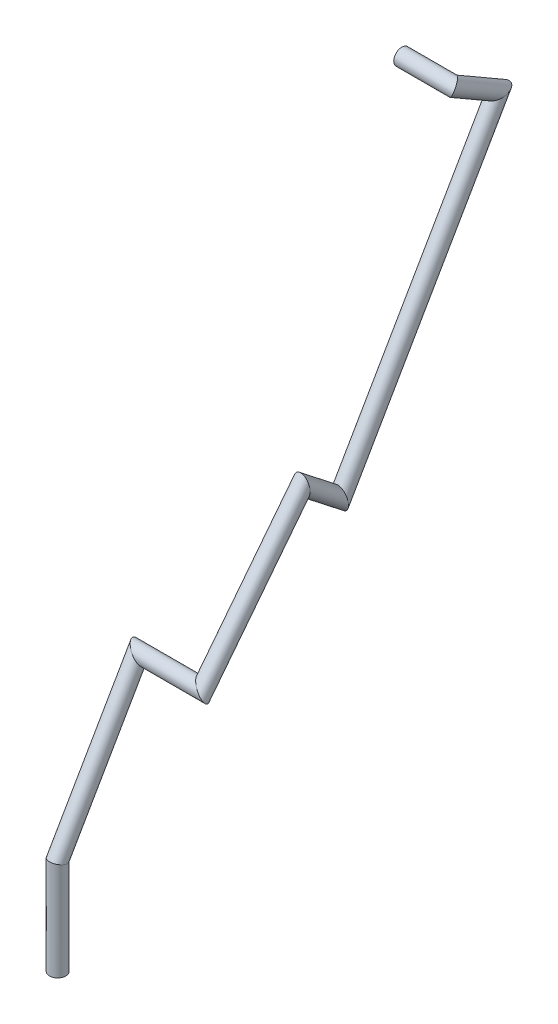
ISO-10303-21;
HEADER;
FILE_DESCRIPTION(('STEP AP214'),'2;1');
FILE_NAME('part.step','',(''),(''),'','','');
FILE_SCHEMA(('AUTOMOTIVE_DESIGN { 1 0 10303 214 1 1 1 1 }'));
ENDSEC;
DATA;
#1=APPLICATION_CONTEXT('core data for automotive mechanical design processes');
#2=APPLICATION_PROTOCOL_DEFINITION('international standard','automotive_design',2000,#1);
#3=PRODUCT_CONTEXT('',#1,'mechanical');
#4=PRODUCT('Part','Part','',(#3));
#5=PRODUCT_RELATED_PRODUCT_CATEGORY('part','',(#4));
#6=PRODUCT_DEFINITION_FORMATION('','',#4);
#7=PRODUCT_DEFINITION_CONTEXT('part definition',#1,'design');
#8=PRODUCT_DEFINITION('design','',#6,#7);
#9=PRODUCT_DEFINITION_SHAPE('','',#8);
#10=(LENGTH_UNIT() NAMED_UNIT(*) SI_UNIT(.MILLI.,.METRE.));
#11=(NAMED_UNIT(*) PLANE_ANGLE_UNIT() SI_UNIT($,.RADIAN.));
#12=(NAMED_UNIT(*) SI_UNIT($,.STERADIAN.) SOLID_ANGLE_UNIT());
#13=UNCERTAINTY_MEASURE_WITH_UNIT(LENGTH_MEASURE(1.E-05),#10,'distance_accuracy_value','');
#14=(GEOMETRIC_REPRESENTATION_CONTEXT(3) GLOBAL_UNCERTAINTY_ASSIGNED_CONTEXT((#13)) GLOBAL_UNIT_ASSIGNED_CONTEXT((#10,
#11,#12)) REPRESENTATION_CONTEXT('',''));
#15=CARTESIAN_POINT('',(0.,0.,0.));
#16=DIRECTION('',(0.,0.,1.));
#17=DIRECTION('',(1.,0.,0.));
#18=AXIS2_PLACEMENT_3D('',#15,#16,#17);
#19=CARTESIAN_POINT('',(3.97846104804465,196.337375310548,-102.746828609833));
#20=DIRECTION('',(1.,0.,0.));
#21=DIRECTION('',(0.,0.,-1.));
#22=AXIS2_PLACEMENT_3D('',#19,#20,#21);
#23=PLANE('',#22);
#24=CARTESIAN_POINT('',(3.97846104804465,196.337375310548,-102.746828609833));
#25=DIRECTION('',(1.,0.,0.));
#26=DIRECTION('',(0.,0.,-1.));
#27=AXIS2_PLACEMENT_3D('',#24,#25,#26);
#28=CIRCLE('',#27,2.5);
#29=CARTESIAN_POINT('',(3.97846104804467,196.337375310548,-105.246828609833));
#30=VERTEX_POINT('',#29);
#31=EDGE_CURVE('E50',#30,#30,#28,.T.);
#32=ORIENTED_EDGE('',*,*,#31,.F.);
#33=EDGE_LOOP('',(#32));
#34=FACE_BOUND('',#33,.T.);
#35=ADVANCED_FACE('F47',(#34),#23,.F.);
#36=CARTESIAN_POINT('',(0.,0.,-1.11022302462516E-13));
#37=DIRECTION('',(0.,-1.,0.));
#38=DIRECTION('',(-0.788010753606722,0.,-0.615661475325659));
#39=AXIS2_PLACEMENT_3D('',#36,#37,#38);
#40=PLANE('',#39);
#41=CARTESIAN_POINT('',(0.,0.,-1.11022302462516E-13));
#42=DIRECTION('',(0.,-1.,0.));
#43=DIRECTION('',(-0.788010753606722,0.,-0.615661475325659));
#44=AXIS2_PLACEMENT_3D('',#41,#42,#43);
#45=CIRCLE('',#44,2.5);
#46=CARTESIAN_POINT('',(-1.9700268840168,0.,-1.53915368831426));
#47=VERTEX_POINT('',#46);
#48=EDGE_CURVE('E55',#47,#47,#45,.T.);
#49=ORIENTED_EDGE('',*,*,#48,.T.);
#50=EDGE_LOOP('',(#49));
#51=FACE_BOUND('',#50,.T.);
#52=ADVANCED_FACE('F94',(#51),#40,.T.);
#53=CARTESIAN_POINT('',(25.2315698604073,196.337375310548,-102.746828609833));
#54=DIRECTION('',(-1.,0.,0.));
#55=DIRECTION('',(0.,0.,1.));
#56=AXIS2_PLACEMENT_3D('',#53,#54,#55);
#57=CYLINDRICAL_SURFACE('',#56,2.5);
#58=CARTESIAN_POINT('',(20.0000000000001,196.337375310548,-102.746828609833));
#59=DIRECTION('',(-0.707106781186547,0.353553390593276,0.612372435695794));
#60=DIRECTION('',(0.707106781186548,0.353553390593275,0.612372435695793));
#61=AXIS2_PLACEMENT_3D('',#58,#59,#60);
#62=ELLIPSE('',#61,3.53553390593275,2.5);
#63=CARTESIAN_POINT('',(22.5000000000001,197.587375310548,-100.581765100372));
#64=VERTEX_POINT('',#63);
#65=EDGE_CURVE('E82',#64,#64,#62,.T.);
#66=ORIENTED_EDGE('',*,*,#65,.T.);
#67=EDGE_LOOP('',(#66));
#68=FACE_BOUND('',#67,.T.);
#69=ORIENTED_EDGE('',*,*,#31,.T.);
#70=EDGE_LOOP('',(#69));
#71=FACE_BOUND('',#70,.T.);
#72=ADVANCED_FACE('F91',(#68,#71),#57,.T.);
#73=CARTESIAN_POINT('',(20.,185.218305450141,-122.005622540966));
#74=DIRECTION('',(0.,0.500000000000002,0.866025403784437));
#75=DIRECTION('',(0.,-0.866025403784437,0.500000000000002));
#76=AXIS2_PLACEMENT_3D('',#73,#74,#75);
#77=CYLINDRICAL_SURFACE('',#76,2.5);
#78=CARTESIAN_POINT('',(20.,188.337375310548,-116.603235070384));
#79=DIRECTION('',(0.,0.965925826289069,0.258819045102519));
#80=DIRECTION('',(0.,0.258819045102519,-0.965925826289069));
#81=AXIS2_PLACEMENT_3D('',#78,#79,#80);
#82=ELLIPSE('',#81,3.53553390593274,2.5);
#83=CARTESIAN_POINT('',(20.,189.252438820009,-120.018298579845));
#84=VERTEX_POINT('',#83);
#85=EDGE_CURVE('E79',#84,#84,#82,.T.);
#86=ORIENTED_EDGE('',*,*,#85,.T.);
#87=EDGE_LOOP('',(#86));
#88=FACE_BOUND('',#87,.T.);
#89=ORIENTED_EDGE('',*,*,#65,.F.);
#90=EDGE_LOOP('',(#89));
#91=FACE_BOUND('',#90,.T.);
#92=ADVANCED_FACE('F126',(#88,#91),#77,.T.);
#93=CARTESIAN_POINT('',(20.,97.265172156007,-64.0226740634172));
#94=DIRECTION('',(0.,0.866025403784438,-0.500000000000001));
#95=DIRECTION('',(0.,0.500000000000001,0.866025403784438));
#96=AXIS2_PLACEMENT_3D('',#93,#94,#95);
#97=CYLINDRICAL_SURFACE('',#96,2.5);
#98=CARTESIAN_POINT('',(20.,103.466885739673,-67.6032350703839));
#99=DIRECTION('',(0.,0.190808995376545,-0.981627183447664));
#100=DIRECTION('',(0.,-0.981627183447664,-0.190808995376545));
#101=AXIS2_PLACEMENT_3D('',#98,#99,#100);
#102=ELLIPSE('',#101,3.81063271676453,2.5);
#103=CARTESIAN_POINT('',(20.,99.7262650787619,-68.3303380708187));
#104=VERTEX_POINT('',#103);
#105=EDGE_CURVE('E75',#104,#104,#102,.T.);
#106=ORIENTED_EDGE('',*,*,#105,.T.);
#107=EDGE_LOOP('',(#106));
#108=FACE_BOUND('',#107,.T.);
#109=ORIENTED_EDGE('',*,*,#85,.F.);
#110=EDGE_LOOP('',(#109));
#111=FACE_BOUND('',#110,.T.);
#112=ADVANCED_FACE('F122',(#108,#111),#97,.T.);
#113=CARTESIAN_POINT('',(20.,116.542390173362,-50.8673525837801));
#114=DIRECTION('',(0.,-0.615661475325658,-0.788010753606722));
#115=DIRECTION('',(0.,0.788010753606722,-0.615661475325658));
#116=AXIS2_PLACEMENT_3D('',#113,#114,#115);
#117=CYLINDRICAL_SURFACE('',#116,2.5);
#118=CARTESIAN_POINT('',(20.,112.701807869558,-55.783073766283));
#119=DIRECTION('',(0.,0.121869343405147,-0.992546151641322));
#120=DIRECTION('',(0.,0.992546151641322,0.121869343405147));
#121=AXIS2_PLACEMENT_3D('',#118,#119,#120);
#122=ELLIPSE('',#121,3.53553390593274,2.5);
#123=CARTESIAN_POINT('',(20.,116.210988441889,-55.3522005705804));
#124=VERTEX_POINT('',#123);
#125=EDGE_CURVE('E71',#124,#124,#122,.T.);
#126=ORIENTED_EDGE('',*,*,#125,.T.);
#127=EDGE_LOOP('',(#126));
#128=FACE_BOUND('',#127,.T.);
#129=ORIENTED_EDGE('',*,*,#105,.F.);
#130=EDGE_LOOP('',(#129));
#131=FACE_BOUND('',#130,.T.);
#132=ADVANCED_FACE('F118',(#128,#131),#117,.T.);
#133=CARTESIAN_POINT('',(20.,69.1787368809762,-21.7791239814725));
#134=DIRECTION('',(0.,0.788010753606721,-0.615661475325659));
#135=DIRECTION('',(0.,0.615661475325659,0.788010753606721));
#136=AXIS2_PLACEMENT_3D('',#133,#134,#135);
#137=CYLINDRICAL_SURFACE('',#136,2.5);
#138=CARTESIAN_POINT('',(20.,73.3012701892219,-25.0000000000001));
#139=DIRECTION('',(0.707106781186547,0.557207747523234,-0.435338404118088));
#140=DIRECTION('',(0.707106781186548,-0.557207747523234,0.435338404118088));
#141=AXIS2_PLACEMENT_3D('',#138,#139,#140);
#142=ELLIPSE('',#141,3.53553390593274,2.5);
#143=CARTESIAN_POINT('',(22.5,71.3312433052051,-23.4608463116859));
#144=VERTEX_POINT('',#143);
#145=EDGE_CURVE('E67',#144,#144,#142,.T.);
#146=ORIENTED_EDGE('',*,*,#145,.T.);
#147=EDGE_LOOP('',(#146));
#148=FACE_BOUND('',#147,.T.);
#149=ORIENTED_EDGE('',*,*,#125,.F.);
#150=EDGE_LOOP('',(#149));
#151=FACE_BOUND('',#150,.T.);
#152=ADVANCED_FACE('F114',(#148,#151),#137,.T.);
#153=CARTESIAN_POINT('',(-5.65316768670955,73.3012701892219,-25.0000000000001));
#154=DIRECTION('',(1.,0.,0.));
#155=DIRECTION('',(0.,1.,0.));
#156=AXIS2_PLACEMENT_3D('',#153,#154,#155);
#157=CYLINDRICAL_SURFACE('',#156,2.5);
#158=CARTESIAN_POINT('',(0.,73.3012701892219,-25.0000000000001));
#159=DIRECTION('',(0.707106781186547,0.612372435695794,-0.353553390593275));
#160=DIRECTION('',(-0.707106781186548,0.612372435695794,-0.353553390593274));
#161=AXIS2_PLACEMENT_3D('',#158,#159,#160);
#162=ELLIPSE('',#161,3.53553390593274,2.5);
#163=CARTESIAN_POINT('',(-2.49999999999999,75.466333698683,-26.2500000000001));
#164=VERTEX_POINT('',#163);
#165=EDGE_CURVE('E61',#164,#164,#162,.T.);
#166=ORIENTED_EDGE('',*,*,#165,.T.);
#167=EDGE_LOOP('',(#166));
#168=FACE_BOUND('',#167,.T.);
#169=ORIENTED_EDGE('',*,*,#145,.F.);
#170=EDGE_LOOP('',(#169));
#171=FACE_BOUND('',#170,.T.);
#172=ADVANCED_FACE('F107',(#168,#171),#157,.T.);
#173=CARTESIAN_POINT('',(0.,28.5147974930303,0.857482067199961));
#174=DIRECTION('',(0.,0.866025403784438,-0.500000000000001));
#175=DIRECTION('',(0.,0.500000000000001,0.866025403784438));
#176=AXIS2_PLACEMENT_3D('',#173,#174,#175);
#177=CYLINDRICAL_SURFACE('',#176,2.5);
#178=CARTESIAN_POINT('',(0.,30.,-1.11022302462516E-13));
#179=DIRECTION('',(0.,0.965925826289068,-0.258819045102521));
#180=DIRECTION('',(0.,0.258819045102521,0.965925826289068));
#181=AXIS2_PLACEMENT_3D('',#178,#179,#180);
#182=ELLIPSE('',#181,2.58819045102521,2.5);
#183=CARTESIAN_POINT('',(0.,30.6698729810778,2.49999999999989));
#184=VERTEX_POINT('',#183);
#185=EDGE_CURVE('E11',#184,#184,#182,.T.);
#186=ORIENTED_EDGE('',*,*,#185,.T.);
#187=EDGE_LOOP('',(#186));
#188=FACE_BOUND('',#187,.T.);
#189=ORIENTED_EDGE('',*,*,#165,.F.);
#190=EDGE_LOOP('',(#189));
#191=FACE_BOUND('',#190,.T.);
#192=ADVANCED_FACE('F101',(#188,#191),#177,.T.);
#193=CARTESIAN_POINT('',(0.,0.,-1.11022302462516E-13));
#194=DIRECTION('',(0.,1.,0.));
#195=DIRECTION('',(0.,0.,1.));
#196=AXIS2_PLACEMENT_3D('',#193,#194,#195);
#197=CYLINDRICAL_SURFACE('',#196,2.5);
#198=ORIENTED_EDGE('',*,*,#48,.F.);
#199=EDGE_LOOP('',(#198));
#200=FACE_BOUND('',#199,.T.);
#201=ORIENTED_EDGE('',*,*,#185,.F.);
#202=EDGE_LOOP('',(#201));
#203=FACE_BOUND('',#202,.T.);
#204=ADVANCED_FACE('F99',(#200,#203),#197,.T.);
#205=CLOSED_SHELL('',(#35,#52,#72,#92,#112,#132,#152,#172,#192,#204));
#206=MANIFOLD_SOLID_BREP('B2',#205);
#207=ADVANCED_BREP_SHAPE_REPRESENTATION('',(#18,#206),#14);
#208=SHAPE_DEFINITION_REPRESENTATION(#9,#207);
ENDSEC;
END-ISO-10303-21;
